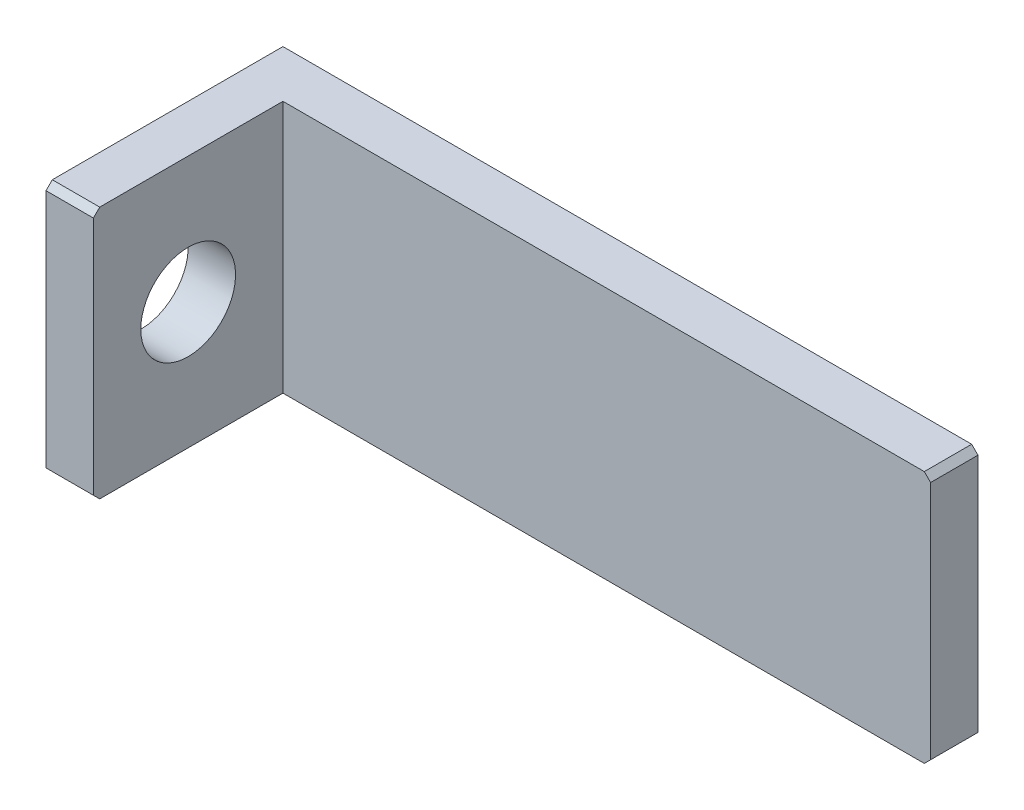
ISO-10303-21;
HEADER;
FILE_DESCRIPTION(('STEP AP214'),'2;1');
FILE_NAME('part.step','',(''),(''),'','','');
FILE_SCHEMA(('AUTOMOTIVE_DESIGN { 1 0 10303 214 1 1 1 1 }'));
ENDSEC;
DATA;
#1=APPLICATION_CONTEXT('core data for automotive mechanical design processes');
#2=APPLICATION_PROTOCOL_DEFINITION('international standard','automotive_design',2000,#1);
#3=PRODUCT_CONTEXT('',#1,'mechanical');
#4=PRODUCT('Part','Part','',(#3));
#5=PRODUCT_RELATED_PRODUCT_CATEGORY('part','',(#4));
#6=PRODUCT_DEFINITION_FORMATION('','',#4);
#7=PRODUCT_DEFINITION_CONTEXT('part definition',#1,'design');
#8=PRODUCT_DEFINITION('design','',#6,#7);
#9=PRODUCT_DEFINITION_SHAPE('','',#8);
#10=(LENGTH_UNIT() NAMED_UNIT(*) SI_UNIT(.MILLI.,.METRE.));
#11=(NAMED_UNIT(*) PLANE_ANGLE_UNIT() SI_UNIT($,.RADIAN.));
#12=(NAMED_UNIT(*) SI_UNIT($,.STERADIAN.) SOLID_ANGLE_UNIT());
#13=UNCERTAINTY_MEASURE_WITH_UNIT(LENGTH_MEASURE(1.E-05),#10,'distance_accuracy_value','');
#14=(GEOMETRIC_REPRESENTATION_CONTEXT(3) GLOBAL_UNCERTAINTY_ASSIGNED_CONTEXT((#13)) GLOBAL_UNIT_ASSIGNED_CONTEXT((#10,
#11,#12)) REPRESENTATION_CONTEXT('',''));
#15=CARTESIAN_POINT('',(0.,0.,0.));
#16=DIRECTION('',(0.,0.,1.));
#17=DIRECTION('',(1.,0.,0.));
#18=AXIS2_PLACEMENT_3D('',#15,#16,#17);
#19=CARTESIAN_POINT('',(-160.507123161513,671.332012286222,-373.857743681072));
#20=DIRECTION('',(-1.,0.,0.));
#21=DIRECTION('',(0.,0.,1.));
#22=AXIS2_PLACEMENT_3D('',#19,#20,#21);
#23=PLANE('',#22);
#24=CARTESIAN_POINT('',(-160.507123161513,667.332012286222,-369.357743681072));
#25=DIRECTION('',(-1.,0.,0.));
#26=DIRECTION('',(0.,0.,1.));
#27=AXIS2_PLACEMENT_3D('',#24,#25,#26);
#28=CIRCLE('',#27,1.49999999999995);
#29=CARTESIAN_POINT('',(-160.507123161513,667.332012286222,-367.857743681072));
#30=VERTEX_POINT('',#29);
#31=EDGE_CURVE('E197',#30,#30,#28,.T.);
#32=ORIENTED_EDGE('',*,*,#31,.F.);
#33=EDGE_LOOP('',(#32));
#34=FACE_BOUND('',#33,.T.);
#35=DIRECTION('',(0.,-1.,0.));
#36=VECTOR('',#35,1.);
#37=CARTESIAN_POINT('',(-160.507123161513,671.332012286222,-366.357743681072));
#38=LINE('',#37,#36);
#39=CARTESIAN_POINT('',(-160.507123161513,671.132012286222,-366.357743681072));
#40=VERTEX_POINT('',#39);
#41=CARTESIAN_POINT('',(-160.507123161513,663.532012286222,-366.357743681072));
#42=VERTEX_POINT('',#41);
#43=EDGE_CURVE('E168',#40,#42,#38,.T.);
#44=ORIENTED_EDGE('',*,*,#43,.F.);
#45=DIRECTION('',(0.,-0.707106781186351,0.707106781186744));
#46=VECTOR('',#45,1.);
#47=CARTESIAN_POINT('',(-160.507123161513,674.982012286222,-370.207743681074));
#48=LINE('',#47,#46);
#49=CARTESIAN_POINT('',(-160.507123161513,671.332012286222,-366.557743681072));
#50=VERTEX_POINT('',#49);
#51=EDGE_CURVE('E70',#40,#50,#48,.F.);
#52=ORIENTED_EDGE('',*,*,#51,.T.);
#53=DIRECTION('',(0.,0.,1.));
#54=VECTOR('',#53,1.);
#55=CARTESIAN_POINT('',(-160.507123161513,671.332012286222,-373.857743681072));
#56=LINE('',#55,#54);
#57=CARTESIAN_POINT('',(-160.507123161513,671.332012286222,-373.857743681072));
#58=VERTEX_POINT('',#57);
#59=EDGE_CURVE('E188',#58,#50,#56,.T.);
#60=ORIENTED_EDGE('',*,*,#59,.F.);
#61=DIRECTION('',(0.,-1.,0.));
#62=VECTOR('',#61,1.);
#63=CARTESIAN_POINT('',(-160.507123161513,671.332012286222,-373.857743681072));
#64=LINE('',#63,#62);
#65=CARTESIAN_POINT('',(-160.507123161513,663.332012286222,-373.857743681072));
#66=VERTEX_POINT('',#65);
#67=EDGE_CURVE('E170',#58,#66,#64,.T.);
#68=ORIENTED_EDGE('',*,*,#67,.T.);
#69=DIRECTION('',(0.,0.,1.));
#70=VECTOR('',#69,1.);
#71=CARTESIAN_POINT('',(-160.507123161513,663.332012286222,-373.857743681072));
#72=LINE('',#71,#70);
#73=CARTESIAN_POINT('',(-160.507123161513,663.332012286222,-366.557743681072));
#74=VERTEX_POINT('',#73);
#75=EDGE_CURVE('E185',#66,#74,#72,.T.);
#76=ORIENTED_EDGE('',*,*,#75,.T.);
#77=DIRECTION('',(0.,-0.707106781186351,-0.707106781186744));
#78=VECTOR('',#77,1.);
#79=CARTESIAN_POINT('',(-160.507123161513,663.68201228622,-366.207743681074));
#80=LINE('',#79,#78);
#81=EDGE_CURVE('E62',#74,#42,#80,.F.);
#82=ORIENTED_EDGE('',*,*,#81,.T.);
#83=EDGE_LOOP('',(#44,#52,#60,#68,#76,#82));
#84=FACE_BOUND('',#83,.T.);
#85=ADVANCED_FACE('F45',(#34,#84),#23,.T.);
#86=CARTESIAN_POINT('',(-138.507123161513,671.332012286222,-373.857743681072));
#87=DIRECTION('',(0.,1.,0.));
#88=DIRECTION('',(0.,0.,1.));
#89=AXIS2_PLACEMENT_3D('',#86,#87,#88);
#90=PLANE('',#89);
#91=DIRECTION('',(1.,0.,0.));
#92=VECTOR('',#91,1.);
#93=CARTESIAN_POINT('',(-159.007123161513,671.332012286222,-372.357743681072));
#94=LINE('',#93,#92);
#95=CARTESIAN_POINT('',(-159.007123161513,671.332012286222,-372.357743681072));
#96=VERTEX_POINT('',#95);
#97=CARTESIAN_POINT('',(-138.707123161513,671.332012286222,-372.357743681072));
#98=VERTEX_POINT('',#97);
#99=EDGE_CURVE('E130',#96,#98,#94,.T.);
#100=ORIENTED_EDGE('',*,*,#99,.T.);
#101=DIRECTION('',(0.,0.,-1.));
#102=VECTOR('',#101,1.);
#103=CARTESIAN_POINT('',(-138.707123161513,671.332012286222,-373.857743681072));
#104=LINE('',#103,#102);
#105=CARTESIAN_POINT('',(-138.707123161513,671.332012286222,-373.857743681072));
#106=VERTEX_POINT('',#105);
#107=EDGE_CURVE('E224',#98,#106,#104,.T.);
#108=ORIENTED_EDGE('',*,*,#107,.T.);
#109=DIRECTION('',(-1.,0.,0.));
#110=VECTOR('',#109,1.);
#111=CARTESIAN_POINT('',(-138.507123161513,671.332012286222,-373.857743681072));
#112=LINE('',#111,#110);
#113=EDGE_CURVE('E182',#106,#58,#112,.T.);
#114=ORIENTED_EDGE('',*,*,#113,.T.);
#115=ORIENTED_EDGE('',*,*,#59,.T.);
#116=DIRECTION('',(1.,0.,0.));
#117=VECTOR('',#116,1.);
#118=CARTESIAN_POINT('',(-138.507123161513,671.332012286222,-366.557743681072));
#119=LINE('',#118,#117);
#120=CARTESIAN_POINT('',(-159.007123161513,671.332012286222,-366.557743681072));
#121=VERTEX_POINT('',#120);
#122=EDGE_CURVE('E133',#50,#121,#119,.T.);
#123=ORIENTED_EDGE('',*,*,#122,.T.);
#124=DIRECTION('',(0.,0.,-1.));
#125=VECTOR('',#124,1.);
#126=CARTESIAN_POINT('',(-159.007123161513,671.332012286222,-366.357743681072));
#127=LINE('',#126,#125);
#128=EDGE_CURVE('E126',#121,#96,#127,.T.);
#129=ORIENTED_EDGE('',*,*,#128,.T.);
#130=EDGE_LOOP('',(#100,#108,#114,#115,#123,#129));
#131=FACE_BOUND('',#130,.T.);
#132=ADVANCED_FACE('F128',(#131),#90,.T.);
#133=CARTESIAN_POINT('',(-138.507123161513,663.332012286222,-373.857743681072));
#134=DIRECTION('',(1.,0.,0.));
#135=DIRECTION('',(0.,0.,-1.));
#136=AXIS2_PLACEMENT_3D('',#133,#134,#135);
#137=PLANE('',#136);
#138=DIRECTION('',(0.,-1.,0.));
#139=VECTOR('',#138,1.);
#140=CARTESIAN_POINT('',(-138.507123161513,671.332012286222,-372.357743681072));
#141=LINE('',#140,#139);
#142=CARTESIAN_POINT('',(-138.507123161513,671.132012286222,-372.357743681072));
#143=VERTEX_POINT('',#142);
#144=CARTESIAN_POINT('',(-138.507123161513,663.532012286222,-372.357743681072));
#145=VERTEX_POINT('',#144);
#146=EDGE_CURVE('E148',#143,#145,#141,.T.);
#147=ORIENTED_EDGE('',*,*,#146,.T.);
#148=DIRECTION('',(0.,0.,-1.));
#149=VECTOR('',#148,1.);
#150=CARTESIAN_POINT('',(-138.507123161513,663.532012286222,-373.857743681072));
#151=LINE('',#150,#149);
#152=CARTESIAN_POINT('',(-138.507123161513,663.532012286222,-373.857743681072));
#153=VERTEX_POINT('',#152);
#154=EDGE_CURVE('E213',#145,#153,#151,.T.);
#155=ORIENTED_EDGE('',*,*,#154,.T.);
#156=DIRECTION('',(0.,1.,0.));
#157=VECTOR('',#156,1.);
#158=CARTESIAN_POINT('',(-138.507123161513,663.332012286222,-373.857743681072));
#159=LINE('',#158,#157);
#160=CARTESIAN_POINT('',(-138.507123161513,671.132012286222,-373.857743681072));
#161=VERTEX_POINT('',#160);
#162=EDGE_CURVE('E178',#153,#161,#159,.T.);
#163=ORIENTED_EDGE('',*,*,#162,.T.);
#164=DIRECTION('',(0.,0.,1.));
#165=VECTOR('',#164,1.);
#166=CARTESIAN_POINT('',(-138.507123161513,671.132012286222,-373.857743681072));
#167=LINE('',#166,#165);
#168=EDGE_CURVE('E209',#161,#143,#167,.T.);
#169=ORIENTED_EDGE('',*,*,#168,.T.);
#170=EDGE_LOOP('',(#147,#155,#163,#169));
#171=FACE_BOUND('',#170,.T.);
#172=ADVANCED_FACE('F266',(#171),#137,.T.);
#173=CARTESIAN_POINT('',(-160.507123161513,663.332012286222,-373.857743681072));
#174=DIRECTION('',(0.,-1.,0.));
#175=DIRECTION('',(0.,0.,-1.));
#176=AXIS2_PLACEMENT_3D('',#173,#174,#175);
#177=PLANE('',#176);
#178=DIRECTION('',(1.,0.,0.));
#179=VECTOR('',#178,1.);
#180=CARTESIAN_POINT('',(-160.507123161513,663.332012286222,-373.857743681072));
#181=LINE('',#180,#179);
#182=CARTESIAN_POINT('',(-138.707123161513,663.332012286222,-373.857743681072));
#183=VERTEX_POINT('',#182);
#184=EDGE_CURVE('E174',#66,#183,#181,.T.);
#185=ORIENTED_EDGE('',*,*,#184,.T.);
#186=DIRECTION('',(0.,0.,1.));
#187=VECTOR('',#186,1.);
#188=CARTESIAN_POINT('',(-138.707123161513,663.332012286222,-373.857743681072));
#189=LINE('',#188,#187);
#190=CARTESIAN_POINT('',(-138.707123161513,663.332012286222,-372.357743681072));
#191=VERTEX_POINT('',#190);
#192=EDGE_CURVE('E200',#183,#191,#189,.T.);
#193=ORIENTED_EDGE('',*,*,#192,.T.);
#194=DIRECTION('',(1.,0.,0.));
#195=VECTOR('',#194,1.);
#196=CARTESIAN_POINT('',(-159.007123161513,663.332012286222,-372.357743681072));
#197=LINE('',#196,#195);
#198=CARTESIAN_POINT('',(-159.007123161513,663.332012286222,-372.357743681072));
#199=VERTEX_POINT('',#198);
#200=EDGE_CURVE('E137',#199,#191,#197,.T.);
#201=ORIENTED_EDGE('',*,*,#200,.F.);
#202=DIRECTION('',(0.,0.,-1.));
#203=VECTOR('',#202,1.);
#204=CARTESIAN_POINT('',(-159.007123161513,663.332012286222,-366.357743681072));
#205=LINE('',#204,#203);
#206=CARTESIAN_POINT('',(-159.007123161513,663.332012286222,-366.557743681072));
#207=VERTEX_POINT('',#206);
#208=EDGE_CURVE('E143',#207,#199,#205,.T.);
#209=ORIENTED_EDGE('',*,*,#208,.F.);
#210=DIRECTION('',(-1.,0.,0.));
#211=VECTOR('',#210,1.);
#212=CARTESIAN_POINT('',(-160.507123161513,663.332012286222,-366.557743681072));
#213=LINE('',#212,#211);
#214=EDGE_CURVE('E191',#207,#74,#213,.T.);
#215=ORIENTED_EDGE('',*,*,#214,.T.);
#216=ORIENTED_EDGE('',*,*,#75,.F.);
#217=EDGE_LOOP('',(#185,#193,#201,#209,#215,#216));
#218=FACE_BOUND('',#217,.T.);
#219=ADVANCED_FACE('F243',(#218),#177,.T.);
#220=CARTESIAN_POINT('',(0.,0.,-373.857743681072));
#221=DIRECTION('',(0.,0.,1.));
#222=DIRECTION('',(1.,0.,0.));
#223=AXIS2_PLACEMENT_3D('',#220,#221,#222);
#224=PLANE('',#223);
#225=ORIENTED_EDGE('',*,*,#162,.F.);
#226=DIRECTION('',(0.7071067811864,0.707106781186695,0.));
#227=VECTOR('',#226,1.);
#228=CARTESIAN_POINT('',(-138.707123161513,663.332012286222,-373.857743681072));
#229=LINE('',#228,#227);
#230=EDGE_CURVE('E219',#153,#183,#229,.F.);
#231=ORIENTED_EDGE('',*,*,#230,.T.);
#232=ORIENTED_EDGE('',*,*,#184,.F.);
#233=ORIENTED_EDGE('',*,*,#67,.F.);
#234=ORIENTED_EDGE('',*,*,#113,.F.);
#235=DIRECTION('',(-0.707106781186695,0.7071067811864,0.));
#236=VECTOR('',#235,1.);
#237=CARTESIAN_POINT('',(-138.507123161513,671.132012286222,-373.857743681072));
#238=LINE('',#237,#236);
#239=EDGE_CURVE('E216',#106,#161,#238,.F.);
#240=ORIENTED_EDGE('',*,*,#239,.T.);
#241=EDGE_LOOP('',(#225,#231,#232,#233,#234,#240));
#242=FACE_BOUND('',#241,.T.);
#243=ADVANCED_FACE('F296',(#242),#224,.F.);
#244=CARTESIAN_POINT('',(0.,0.,-366.357743681072));
#245=DIRECTION('',(0.,0.,1.));
#246=DIRECTION('',(1.,0.,0.));
#247=AXIS2_PLACEMENT_3D('',#244,#245,#246);
#248=PLANE('',#247);
#249=DIRECTION('',(0.,-1.,0.));
#250=VECTOR('',#249,1.);
#251=CARTESIAN_POINT('',(-159.007123161513,671.332012286222,-366.357743681072));
#252=LINE('',#251,#250);
#253=CARTESIAN_POINT('',(-159.007123161513,671.132012286222,-366.357743681072));
#254=VERTEX_POINT('',#253);
#255=CARTESIAN_POINT('',(-159.007123161513,663.532012286222,-366.357743681072));
#256=VERTEX_POINT('',#255);
#257=EDGE_CURVE('E149',#254,#256,#252,.T.);
#258=ORIENTED_EDGE('',*,*,#257,.F.);
#259=DIRECTION('',(-1.,0.,0.));
#260=VECTOR('',#259,1.);
#261=CARTESIAN_POINT('',(0.,671.132012286222,-366.357743681072));
#262=LINE('',#261,#260);
#263=EDGE_CURVE('E231',#254,#40,#262,.T.);
#264=ORIENTED_EDGE('',*,*,#263,.T.);
#265=ORIENTED_EDGE('',*,*,#43,.T.);
#266=DIRECTION('',(1.,0.,0.));
#267=VECTOR('',#266,1.);
#268=CARTESIAN_POINT('',(0.,663.532012286222,-366.357743681072));
#269=LINE('',#268,#267);
#270=EDGE_CURVE('E227',#42,#256,#269,.T.);
#271=ORIENTED_EDGE('',*,*,#270,.T.);
#272=EDGE_LOOP('',(#258,#264,#265,#271));
#273=FACE_BOUND('',#272,.T.);
#274=ADVANCED_FACE('F245',(#273),#248,.T.);
#275=CARTESIAN_POINT('',(-159.007123161513,671.332012286222,-372.357743681072));
#276=DIRECTION('',(0.,0.,-1.));
#277=DIRECTION('',(-1.,0.,0.));
#278=AXIS2_PLACEMENT_3D('',#275,#276,#277);
#279=PLANE('',#278);
#280=ORIENTED_EDGE('',*,*,#200,.T.);
#281=DIRECTION('',(-0.7071067811864,-0.707106781186695,0.));
#282=VECTOR('',#281,1.);
#283=CARTESIAN_POINT('',(-138.707123161513,663.332012286222,-372.357743681072));
#284=LINE('',#283,#282);
#285=EDGE_CURVE('E206',#191,#145,#284,.F.);
#286=ORIENTED_EDGE('',*,*,#285,.T.);
#287=ORIENTED_EDGE('',*,*,#146,.F.);
#288=DIRECTION('',(0.707106781186695,-0.7071067811864,0.));
#289=VECTOR('',#288,1.);
#290=CARTESIAN_POINT('',(-138.507123161513,671.132012286222,-372.357743681072));
#291=LINE('',#290,#289);
#292=EDGE_CURVE('E153',#143,#98,#291,.F.);
#293=ORIENTED_EDGE('',*,*,#292,.T.);
#294=ORIENTED_EDGE('',*,*,#99,.F.);
#295=DIRECTION('',(0.,-1.,0.));
#296=VECTOR('',#295,1.);
#297=CARTESIAN_POINT('',(-159.007123161513,671.332012286222,-372.357743681072));
#298=LINE('',#297,#296);
#299=EDGE_CURVE('E140',#96,#199,#298,.T.);
#300=ORIENTED_EDGE('',*,*,#299,.T.);
#301=EDGE_LOOP('',(#280,#286,#287,#293,#294,#300));
#302=FACE_BOUND('',#301,.T.);
#303=ADVANCED_FACE('F151',(#302),#279,.F.);
#304=CARTESIAN_POINT('',(-159.007123161513,671.332012286222,-366.357743681072));
#305=DIRECTION('',(-1.,0.,0.));
#306=DIRECTION('',(0.,0.,1.));
#307=AXIS2_PLACEMENT_3D('',#304,#305,#306);
#308=PLANE('',#307);
#309=CARTESIAN_POINT('',(-159.007123161513,667.332012286222,-369.357743681072));
#310=DIRECTION('',(-1.,0.,0.));
#311=DIRECTION('',(0.,0.,1.));
#312=AXIS2_PLACEMENT_3D('',#309,#310,#311);
#313=CIRCLE('',#312,1.49999999999995);
#314=CARTESIAN_POINT('',(-159.007123161513,667.332012286222,-367.857743681072));
#315=VERTEX_POINT('',#314);
#316=EDGE_CURVE('E163',#315,#315,#313,.T.);
#317=ORIENTED_EDGE('',*,*,#316,.T.);
#318=EDGE_LOOP('',(#317));
#319=FACE_BOUND('',#318,.T.);
#320=ORIENTED_EDGE('',*,*,#128,.F.);
#321=DIRECTION('',(0.,0.707106781186351,-0.707106781186744));
#322=VECTOR('',#321,1.);
#323=CARTESIAN_POINT('',(-159.007123161513,671.132012286222,-366.357743681072));
#324=LINE('',#323,#322);
#325=EDGE_CURVE('E11',#121,#254,#324,.F.);
#326=ORIENTED_EDGE('',*,*,#325,.T.);
#327=ORIENTED_EDGE('',*,*,#257,.T.);
#328=DIRECTION('',(0.,0.707106781186351,0.707106781186744));
#329=VECTOR('',#328,1.);
#330=CARTESIAN_POINT('',(-159.007123161513,663.532012286222,-366.357743681072));
#331=LINE('',#330,#329);
#332=EDGE_CURVE('E55',#256,#207,#331,.F.);
#333=ORIENTED_EDGE('',*,*,#332,.T.);
#334=ORIENTED_EDGE('',*,*,#208,.T.);
#335=ORIENTED_EDGE('',*,*,#299,.F.);
#336=EDGE_LOOP('',(#320,#326,#327,#333,#334,#335));
#337=FACE_BOUND('',#336,.T.);
#338=ADVANCED_FACE('F141',(#319,#337),#308,.F.);
#339=CARTESIAN_POINT('',(-160.507123161513,667.332012286222,-369.357743681072));
#340=DIRECTION('',(-1.,0.,0.));
#341=DIRECTION('',(0.,0.,1.));
#342=AXIS2_PLACEMENT_3D('',#339,#340,#341);
#343=CYLINDRICAL_SURFACE('',#342,1.49999999999995);
#344=ORIENTED_EDGE('',*,*,#31,.T.);
#345=EDGE_LOOP('',(#344));
#346=FACE_BOUND('',#345,.T.);
#347=ORIENTED_EDGE('',*,*,#316,.F.);
#348=EDGE_LOOP('',(#347));
#349=FACE_BOUND('',#348,.T.);
#350=ADVANCED_FACE('F277',(#346,#349),#343,.F.);
#351=CARTESIAN_POINT('',(-138.707123161513,663.332012286222,-373.857743681072));
#352=DIRECTION('',(-0.707106781186695,0.7071067811864,0.));
#353=DIRECTION('',(0.,0.,1.));
#354=AXIS2_PLACEMENT_3D('',#351,#352,#353);
#355=PLANE('',#354);
#356=ORIENTED_EDGE('',*,*,#230,.F.);
#357=ORIENTED_EDGE('',*,*,#154,.F.);
#358=ORIENTED_EDGE('',*,*,#285,.F.);
#359=ORIENTED_EDGE('',*,*,#192,.F.);
#360=EDGE_LOOP('',(#356,#357,#358,#359));
#361=FACE_BOUND('',#360,.T.);
#362=ADVANCED_FACE('F256',(#361),#355,.F.);
#363=CARTESIAN_POINT('',(-138.507123161513,671.132012286222,-373.857743681072));
#364=DIRECTION('',(-0.7071067811864,-0.707106781186695,0.));
#365=DIRECTION('',(0.,0.,1.));
#366=AXIS2_PLACEMENT_3D('',#363,#364,#365);
#367=PLANE('',#366);
#368=ORIENTED_EDGE('',*,*,#239,.F.);
#369=ORIENTED_EDGE('',*,*,#107,.F.);
#370=ORIENTED_EDGE('',*,*,#292,.F.);
#371=ORIENTED_EDGE('',*,*,#168,.F.);
#372=EDGE_LOOP('',(#368,#369,#370,#371));
#373=FACE_BOUND('',#372,.T.);
#374=ADVANCED_FACE('F251',(#373),#367,.F.);
#375=CARTESIAN_POINT('',(0.,671.132012286222,-366.357743681072));
#376=DIRECTION('',(0.,-0.707106781186744,-0.707106781186351));
#377=DIRECTION('',(-1.,0.,0.));
#378=AXIS2_PLACEMENT_3D('',#375,#376,#377);
#379=PLANE('',#378);
#380=ORIENTED_EDGE('',*,*,#325,.F.);
#381=ORIENTED_EDGE('',*,*,#122,.F.);
#382=ORIENTED_EDGE('',*,*,#51,.F.);
#383=ORIENTED_EDGE('',*,*,#263,.F.);
#384=EDGE_LOOP('',(#380,#381,#382,#383));
#385=FACE_BOUND('',#384,.T.);
#386=ADVANCED_FACE('F249',(#385),#379,.F.);
#387=CARTESIAN_POINT('',(0.,663.532012286222,-366.357743681072));
#388=DIRECTION('',(0.,0.707106781186744,-0.707106781186351));
#389=DIRECTION('',(1.,0.,0.));
#390=AXIS2_PLACEMENT_3D('',#387,#388,#389);
#391=PLANE('',#390);
#392=ORIENTED_EDGE('',*,*,#81,.F.);
#393=ORIENTED_EDGE('',*,*,#214,.F.);
#394=ORIENTED_EDGE('',*,*,#332,.F.);
#395=ORIENTED_EDGE('',*,*,#270,.F.);
#396=EDGE_LOOP('',(#392,#393,#394,#395));
#397=FACE_BOUND('',#396,.T.);
#398=ADVANCED_FACE('F48',(#397),#391,.F.);
#399=CLOSED_SHELL('',(#85,#132,#172,#219,#243,#274,#303,#338,#350,#362,#374,#386,#398));
#400=MANIFOLD_SOLID_BREP('B2',#399);
#401=ADVANCED_BREP_SHAPE_REPRESENTATION('',(#18,#400),#14);
#402=SHAPE_DEFINITION_REPRESENTATION(#9,#401);
ENDSEC;
END-ISO-10303-21;
